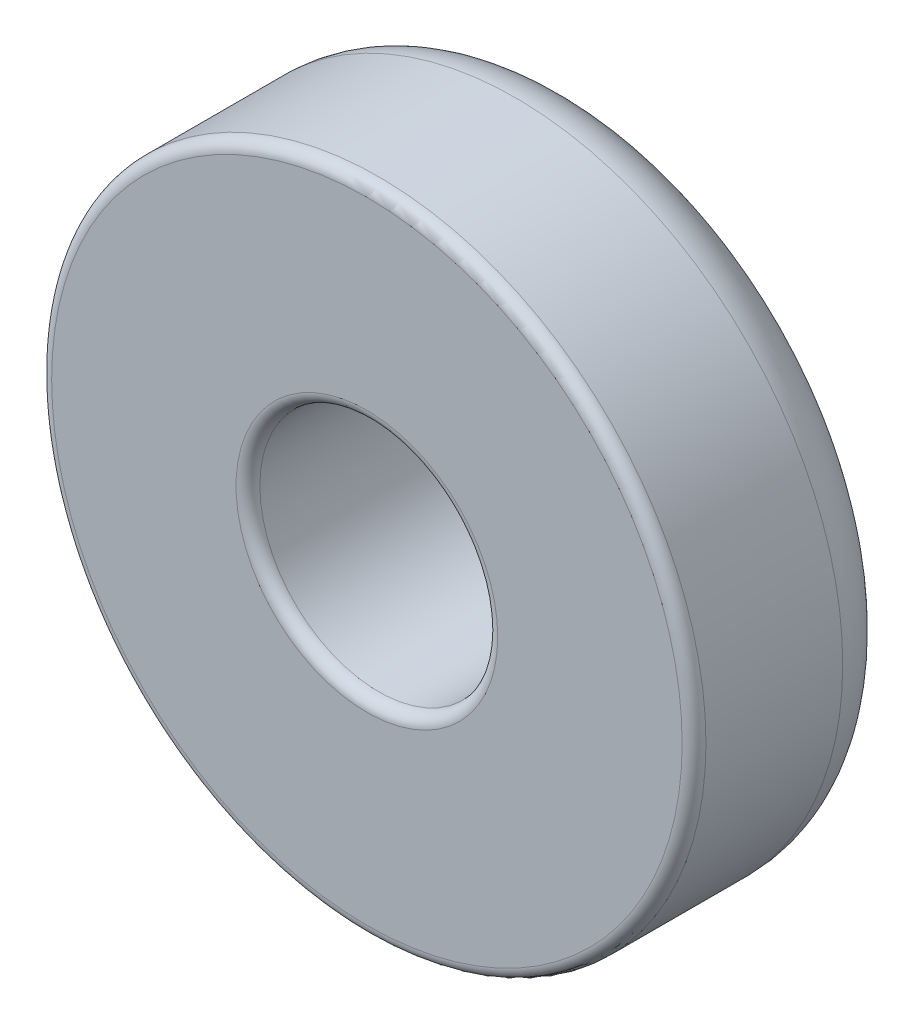
ISO-10303-21;
HEADER;
FILE_DESCRIPTION(('STEP AP214'),'2;1');
FILE_NAME('part.step','',(''),(''),'','','');
FILE_SCHEMA(('AUTOMOTIVE_DESIGN { 1 0 10303 214 1 1 1 1 }'));
ENDSEC;
DATA;
#1=APPLICATION_CONTEXT('core data for automotive mechanical design processes');
#2=APPLICATION_PROTOCOL_DEFINITION('international standard','automotive_design',2000,#1);
#3=PRODUCT_CONTEXT('',#1,'mechanical');
#4=PRODUCT('Part','Part','',(#3));
#5=PRODUCT_RELATED_PRODUCT_CATEGORY('part','',(#4));
#6=PRODUCT_DEFINITION_FORMATION('','',#4);
#7=PRODUCT_DEFINITION_CONTEXT('part definition',#1,'design');
#8=PRODUCT_DEFINITION('design','',#6,#7);
#9=PRODUCT_DEFINITION_SHAPE('','',#8);
#10=(LENGTH_UNIT() NAMED_UNIT(*) SI_UNIT(.MILLI.,.METRE.));
#11=(NAMED_UNIT(*) PLANE_ANGLE_UNIT() SI_UNIT($,.RADIAN.));
#12=(NAMED_UNIT(*) SI_UNIT($,.STERADIAN.) SOLID_ANGLE_UNIT());
#13=UNCERTAINTY_MEASURE_WITH_UNIT(LENGTH_MEASURE(1.E-05),#10,'distance_accuracy_value','');
#14=(GEOMETRIC_REPRESENTATION_CONTEXT(3) GLOBAL_UNCERTAINTY_ASSIGNED_CONTEXT((#13)) GLOBAL_UNIT_ASSIGNED_CONTEXT((#10,
#11,#12)) REPRESENTATION_CONTEXT('',''));
#15=CARTESIAN_POINT('',(0.,0.,0.));
#16=DIRECTION('',(0.,0.,1.));
#17=DIRECTION('',(1.,0.,0.));
#18=AXIS2_PLACEMENT_3D('',#15,#16,#17);
#19=CARTESIAN_POINT('',(0.,0.,0.77875));
#20=DIRECTION('',(0.,0.,1.));
#21=DIRECTION('',(1.,0.,0.));
#22=AXIS2_PLACEMENT_3D('',#19,#20,#21);
#23=PLANE('',#22);
#24=CARTESIAN_POINT('',(0.,0.,0.77875));
#25=DIRECTION('',(0.,0.,1.));
#26=DIRECTION('',(1.,0.,0.));
#27=AXIS2_PLACEMENT_3D('',#24,#25,#26);
#28=CIRCLE('',#27,1.17925);
#29=CARTESIAN_POINT('',(1.17925,0.,0.77875));
#30=VERTEX_POINT('',#29);
#31=EDGE_CURVE('E62',#30,#30,#28,.T.);
#32=ORIENTED_EDGE('',*,*,#31,.T.);
#33=EDGE_LOOP('',(#32));
#34=FACE_BOUND('',#33,.T.);
#35=CARTESIAN_POINT('',(0.,0.,0.77875));
#36=DIRECTION('',(0.,0.,1.));
#37=DIRECTION('',(1.,0.,0.));
#38=AXIS2_PLACEMENT_3D('',#35,#36,#37);
#39=CIRCLE('',#38,0.4895);
#40=CARTESIAN_POINT('',(0.4895,0.,0.77875));
#41=VERTEX_POINT('',#40);
#42=EDGE_CURVE('E65',#41,#41,#39,.F.);
#43=ORIENTED_EDGE('',*,*,#42,.T.);
#44=EDGE_LOOP('',(#43));
#45=FACE_BOUND('',#44,.T.);
#46=ADVANCED_FACE('F36',(#34,#45),#23,.T.);
#47=CARTESIAN_POINT('',(0.,0.,0.));
#48=DIRECTION('',(0.,0.,1.));
#49=DIRECTION('',(1.,0.,0.));
#50=AXIS2_PLACEMENT_3D('',#47,#48,#49);
#51=PLANE('',#50);
#52=CARTESIAN_POINT('',(0.,0.,0.));
#53=DIRECTION('',(0.,0.,1.));
#54=DIRECTION('',(1.,0.,0.));
#55=AXIS2_PLACEMENT_3D('',#52,#53,#54);
#56=CIRCLE('',#55,1.00125);
#57=CARTESIAN_POINT('',(1.00125,0.,0.));
#58=VERTEX_POINT('',#57);
#59=EDGE_CURVE('E11',#58,#58,#56,.F.);
#60=ORIENTED_EDGE('',*,*,#59,.T.);
#61=EDGE_LOOP('',(#60));
#62=FACE_BOUND('',#61,.T.);
#63=CARTESIAN_POINT('',(0.,0.,0.));
#64=DIRECTION('',(0.,0.,1.));
#65=DIRECTION('',(1.,0.,0.));
#66=AXIS2_PLACEMENT_3D('',#63,#64,#65);
#67=CIRCLE('',#66,0.4895);
#68=CARTESIAN_POINT('',(0.4895,0.,0.));
#69=VERTEX_POINT('',#68);
#70=EDGE_CURVE('E56',#69,#69,#67,.T.);
#71=ORIENTED_EDGE('',*,*,#70,.T.);
#72=EDGE_LOOP('',(#71));
#73=FACE_BOUND('',#72,.T.);
#74=ADVANCED_FACE('F88',(#62,#73),#51,.F.);
#75=CARTESIAN_POINT('',(0.,0.,0.77875));
#76=DIRECTION('',(0.,0.,-1.));
#77=DIRECTION('',(-1.,0.,0.));
#78=AXIS2_PLACEMENT_3D('',#75,#76,#77);
#79=CYLINDRICAL_SURFACE('',#78,1.22375);
#80=CARTESIAN_POINT('',(0.,0.,0.2225));
#81=DIRECTION('',(0.,0.,1.));
#82=DIRECTION('',(1.,0.,0.));
#83=AXIS2_PLACEMENT_3D('',#80,#81,#82);
#84=CIRCLE('',#83,1.22375);
#85=CARTESIAN_POINT('',(1.22375,0.,0.2225));
#86=VERTEX_POINT('',#85);
#87=EDGE_CURVE('E43',#86,#86,#84,.T.);
#88=ORIENTED_EDGE('',*,*,#87,.T.);
#89=EDGE_LOOP('',(#88));
#90=FACE_BOUND('',#89,.T.);
#91=CARTESIAN_POINT('',(0.,0.,0.73425));
#92=DIRECTION('',(0.,0.,1.));
#93=DIRECTION('',(1.,0.,0.));
#94=AXIS2_PLACEMENT_3D('',#91,#92,#93);
#95=CIRCLE('',#94,1.22375);
#96=CARTESIAN_POINT('',(1.22375,0.,0.73425));
#97=VERTEX_POINT('',#96);
#98=EDGE_CURVE('E59',#97,#97,#95,.F.);
#99=ORIENTED_EDGE('',*,*,#98,.T.);
#100=EDGE_LOOP('',(#99));
#101=FACE_BOUND('',#100,.T.);
#102=ADVANCED_FACE('F79',(#90,#101),#79,.T.);
#103=CARTESIAN_POINT('',(0.,0.,0.77875));
#104=DIRECTION('',(0.,0.,-1.));
#105=DIRECTION('',(-1.,0.,0.));
#106=AXIS2_PLACEMENT_3D('',#103,#104,#105);
#107=CYLINDRICAL_SURFACE('',#106,0.445);
#108=CARTESIAN_POINT('',(0.,0.,0.0445));
#109=DIRECTION('',(0.,0.,1.));
#110=DIRECTION('',(1.,0.,0.));
#111=AXIS2_PLACEMENT_3D('',#108,#109,#110);
#112=CIRCLE('',#111,0.445);
#113=CARTESIAN_POINT('',(0.445,0.,0.0445));
#114=VERTEX_POINT('',#113);
#115=EDGE_CURVE('E47',#114,#114,#112,.F.);
#116=ORIENTED_EDGE('',*,*,#115,.T.);
#117=EDGE_LOOP('',(#116));
#118=FACE_BOUND('',#117,.T.);
#119=CARTESIAN_POINT('',(0.,0.,0.73425));
#120=DIRECTION('',(0.,0.,1.));
#121=DIRECTION('',(1.,0.,0.));
#122=AXIS2_PLACEMENT_3D('',#119,#120,#121);
#123=CIRCLE('',#122,0.445);
#124=CARTESIAN_POINT('',(0.445,0.,0.73425));
#125=VERTEX_POINT('',#124);
#126=EDGE_CURVE('E51',#125,#125,#123,.T.);
#127=ORIENTED_EDGE('',*,*,#126,.T.);
#128=EDGE_LOOP('',(#127));
#129=FACE_BOUND('',#128,.T.);
#130=ADVANCED_FACE('F76',(#118,#129),#107,.F.);
#131=CARTESIAN_POINT('',(0.,0.,0.73425));
#132=DIRECTION('',(0.,0.,1.));
#133=DIRECTION('',(1.,0.,0.));
#134=AXIS2_PLACEMENT_3D('',#131,#132,#133);
#135=TOROIDAL_SURFACE('',#134,1.17925,0.0445);
#136=ORIENTED_EDGE('',*,*,#98,.F.);
#137=EDGE_LOOP('',(#136));
#138=FACE_BOUND('',#137,.T.);
#139=ORIENTED_EDGE('',*,*,#31,.F.);
#140=EDGE_LOOP('',(#139));
#141=FACE_BOUND('',#140,.T.);
#142=ADVANCED_FACE('F78',(#138,#141),#135,.T.);
#143=CARTESIAN_POINT('',(0.,0.,0.0445));
#144=DIRECTION('',(0.,0.,1.));
#145=DIRECTION('',(1.,0.,0.));
#146=AXIS2_PLACEMENT_3D('',#143,#144,#145);
#147=TOROIDAL_SURFACE('',#146,0.4895,0.0445);
#148=ORIENTED_EDGE('',*,*,#115,.F.);
#149=EDGE_LOOP('',(#148));
#150=FACE_BOUND('',#149,.T.);
#151=ORIENTED_EDGE('',*,*,#70,.F.);
#152=EDGE_LOOP('',(#151));
#153=FACE_BOUND('',#152,.T.);
#154=ADVANCED_FACE('F73',(#150,#153),#147,.T.);
#155=CARTESIAN_POINT('',(0.,0.,0.73425));
#156=DIRECTION('',(0.,0.,1.));
#157=DIRECTION('',(1.,0.,0.));
#158=AXIS2_PLACEMENT_3D('',#155,#156,#157);
#159=TOROIDAL_SURFACE('',#158,0.4895,0.0445);
#160=ORIENTED_EDGE('',*,*,#42,.F.);
#161=EDGE_LOOP('',(#160));
#162=FACE_BOUND('',#161,.T.);
#163=ORIENTED_EDGE('',*,*,#126,.F.);
#164=EDGE_LOOP('',(#163));
#165=FACE_BOUND('',#164,.T.);
#166=ADVANCED_FACE('F70',(#162,#165),#159,.T.);
#167=CARTESIAN_POINT('',(0.,0.,0.2225));
#168=DIRECTION('',(0.,0.,1.));
#169=DIRECTION('',(1.,0.,0.));
#170=AXIS2_PLACEMENT_3D('',#167,#168,#169);
#171=TOROIDAL_SURFACE('',#170,1.00125,0.2225);
#172=ORIENTED_EDGE('',*,*,#59,.F.);
#173=EDGE_LOOP('',(#172));
#174=FACE_BOUND('',#173,.T.);
#175=ORIENTED_EDGE('',*,*,#87,.F.);
#176=EDGE_LOOP('',(#175));
#177=FACE_BOUND('',#176,.T.);
#178=ADVANCED_FACE('F38',(#174,#177),#171,.T.);
#179=CLOSED_SHELL('',(#46,#74,#102,#130,#142,#154,#166,#178));
#180=MANIFOLD_SOLID_BREP('B2',#179);
#181=ADVANCED_BREP_SHAPE_REPRESENTATION('',(#18,#180),#14);
#182=SHAPE_DEFINITION_REPRESENTATION(#9,#181);
ENDSEC;
END-ISO-10303-21;
